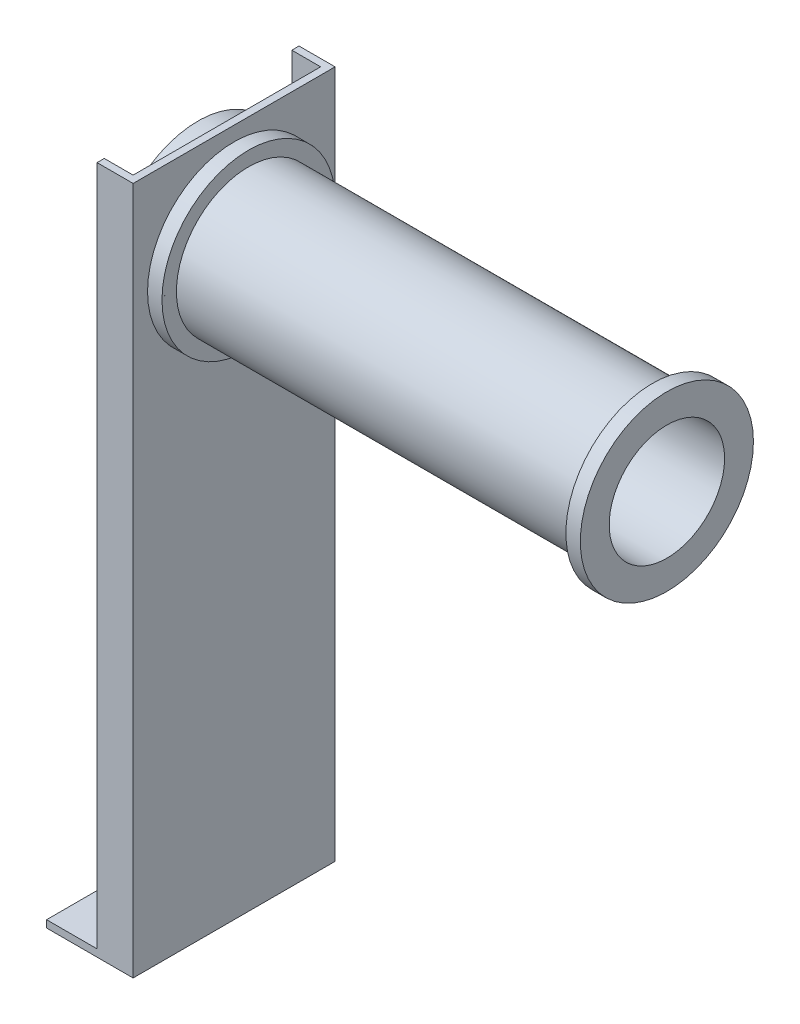
ISO-10303-21;
HEADER;
FILE_DESCRIPTION(('STEP AP214'),'2;1');
FILE_NAME('part.step','',(''),(''),'','','');
FILE_SCHEMA(('AUTOMOTIVE_DESIGN { 1 0 10303 214 1 1 1 1 }'));
ENDSEC;
DATA;
#1=APPLICATION_CONTEXT('core data for automotive mechanical design processes');
#2=APPLICATION_PROTOCOL_DEFINITION('international standard','automotive_design',2000,#1);
#3=PRODUCT_CONTEXT('',#1,'mechanical');
#4=PRODUCT('Part','Part','',(#3));
#5=PRODUCT_RELATED_PRODUCT_CATEGORY('part','',(#4));
#6=PRODUCT_DEFINITION_FORMATION('','',#4);
#7=PRODUCT_DEFINITION_CONTEXT('part definition',#1,'design');
#8=PRODUCT_DEFINITION('design','',#6,#7);
#9=PRODUCT_DEFINITION_SHAPE('','',#8);
#10=(LENGTH_UNIT() NAMED_UNIT(*) SI_UNIT(.MILLI.,.METRE.));
#11=(NAMED_UNIT(*) PLANE_ANGLE_UNIT() SI_UNIT($,.RADIAN.));
#12=(NAMED_UNIT(*) SI_UNIT($,.STERADIAN.) SOLID_ANGLE_UNIT());
#13=UNCERTAINTY_MEASURE_WITH_UNIT(LENGTH_MEASURE(1.E-05),#10,'distance_accuracy_value','');
#14=(GEOMETRIC_REPRESENTATION_CONTEXT(3) GLOBAL_UNCERTAINTY_ASSIGNED_CONTEXT((#13)) GLOBAL_UNIT_ASSIGNED_CONTEXT((#10,
#11,#12)) REPRESENTATION_CONTEXT('',''));
#15=CARTESIAN_POINT('',(0.,0.,0.));
#16=DIRECTION('',(0.,0.,1.));
#17=DIRECTION('',(1.,0.,0.));
#18=AXIS2_PLACEMENT_3D('',#15,#16,#17);
#19=CARTESIAN_POINT('',(0.,0.,0.));
#20=DIRECTION('',(-1.,0.,0.));
#21=DIRECTION('',(0.,0.,1.));
#22=AXIS2_PLACEMENT_3D('',#19,#20,#21);
#23=PLANE('',#22);
#24=CARTESIAN_POINT('',(0.,52.705,0.));
#25=DIRECTION('',(-1.,0.,0.));
#26=DIRECTION('',(0.,0.,1.));
#27=AXIS2_PLACEMENT_3D('',#24,#25,#26);
#28=CIRCLE('',#27,19.05);
#29=CARTESIAN_POINT('',(0.,52.705,19.05));
#30=VERTEX_POINT('',#29);
#31=EDGE_CURVE('E441',#30,#30,#28,.T.);
#32=ORIENTED_EDGE('',*,*,#31,.F.);
#33=EDGE_LOOP('',(#32));
#34=FACE_BOUND('',#33,.T.);
#35=DIRECTION('',(0.,0.,1.));
#36=VECTOR('',#35,1.);
#37=CARTESIAN_POINT('',(0.,74.93,22.225));
#38=LINE('',#37,#36);
#39=CARTESIAN_POINT('',(0.,74.93,-20.6375));
#40=VERTEX_POINT('',#39);
#41=CARTESIAN_POINT('',(0.,74.93,20.6375));
#42=VERTEX_POINT('',#41);
#43=EDGE_CURVE('E64',#40,#42,#38,.T.);
#44=ORIENTED_EDGE('',*,*,#43,.F.);
#45=DIRECTION('',(0.,1.,0.));
#46=VECTOR('',#45,1.);
#47=CARTESIAN_POINT('',(0.,74.93,-20.6375));
#48=LINE('',#47,#46);
#49=CARTESIAN_POINT('',(0.,-74.93,-20.6375));
#50=VERTEX_POINT('',#49);
#51=EDGE_CURVE('E173',#50,#40,#48,.T.);
#52=ORIENTED_EDGE('',*,*,#51,.F.);
#53=DIRECTION('',(0.,0.,-1.));
#54=VECTOR('',#53,1.);
#55=CARTESIAN_POINT('',(0.,-74.93,22.225));
#56=LINE('',#55,#54);
#57=CARTESIAN_POINT('',(0.,-74.93,20.6375));
#58=VERTEX_POINT('',#57);
#59=EDGE_CURVE('E226',#58,#50,#56,.T.);
#60=ORIENTED_EDGE('',*,*,#59,.F.);
#61=DIRECTION('',(0.,-1.,0.));
#62=VECTOR('',#61,1.);
#63=CARTESIAN_POINT('',(0.,74.93,20.6375));
#64=LINE('',#63,#62);
#65=EDGE_CURVE('E197',#42,#58,#64,.T.);
#66=ORIENTED_EDGE('',*,*,#65,.F.);
#67=EDGE_LOOP('',(#44,#52,#60,#66));
#68=FACE_BOUND('',#67,.T.);
#69=ADVANCED_FACE('F41',(#34,#68),#23,.T.);
#70=CARTESIAN_POINT('',(1.5875,-74.93,-22.225));
#71=DIRECTION('',(0.,0.,1.));
#72=DIRECTION('',(1.,0.,0.));
#73=AXIS2_PLACEMENT_3D('',#70,#71,#72);
#74=PLANE('',#73);
#75=DIRECTION('',(0.,1.,0.));
#76=VECTOR('',#75,1.);
#77=CARTESIAN_POINT('',(1.5875,-74.93,-22.225));
#78=LINE('',#77,#76);
#79=CARTESIAN_POINT('',(1.5875,-76.5175,-22.225));
#80=VERTEX_POINT('',#79);
#81=CARTESIAN_POINT('',(1.5875,74.93,-22.225));
#82=VERTEX_POINT('',#81);
#83=EDGE_CURVE('E223',#80,#82,#78,.T.);
#84=ORIENTED_EDGE('',*,*,#83,.F.);
#85=DIRECTION('',(1.,0.,0.));
#86=VECTOR('',#85,1.);
#87=CARTESIAN_POINT('',(1.5875,-76.5175,-22.225));
#88=LINE('',#87,#86);
#89=CARTESIAN_POINT('',(-17.4625,-76.5175,-22.225));
#90=VERTEX_POINT('',#89);
#91=EDGE_CURVE('E147',#90,#80,#88,.T.);
#92=ORIENTED_EDGE('',*,*,#91,.F.);
#93=DIRECTION('',(0.,1.,0.));
#94=VECTOR('',#93,1.);
#95=CARTESIAN_POINT('',(-17.4625,-76.5175,-22.225));
#96=LINE('',#95,#94);
#97=CARTESIAN_POINT('',(-17.4625,-74.93,-22.225));
#98=VERTEX_POINT('',#97);
#99=EDGE_CURVE('E162',#90,#98,#96,.T.);
#100=ORIENTED_EDGE('',*,*,#99,.T.);
#101=DIRECTION('',(1.,0.,0.));
#102=VECTOR('',#101,1.);
#103=CARTESIAN_POINT('',(1.5875,-74.93,-22.225));
#104=LINE('',#103,#102);
#105=CARTESIAN_POINT('',(-6.35,-74.93,-22.225));
#106=VERTEX_POINT('',#105);
#107=EDGE_CURVE('E149',#98,#106,#104,.T.);
#108=ORIENTED_EDGE('',*,*,#107,.T.);
#109=DIRECTION('',(0.,-1.,0.));
#110=VECTOR('',#109,1.);
#111=CARTESIAN_POINT('',(-6.35,74.93,-22.225));
#112=LINE('',#111,#110);
#113=CARTESIAN_POINT('',(-6.35,74.93,-22.225));
#114=VERTEX_POINT('',#113);
#115=EDGE_CURVE('E174',#114,#106,#112,.T.);
#116=ORIENTED_EDGE('',*,*,#115,.F.);
#117=DIRECTION('',(-1.,0.,0.));
#118=VECTOR('',#117,1.);
#119=CARTESIAN_POINT('',(1.5875,74.93,-22.225));
#120=LINE('',#119,#118);
#121=EDGE_CURVE('E235',#82,#114,#120,.T.);
#122=ORIENTED_EDGE('',*,*,#121,.F.);
#123=EDGE_LOOP('',(#84,#92,#100,#108,#116,#122));
#124=FACE_BOUND('',#123,.T.);
#125=ADVANCED_FACE('F43',(#124),#74,.F.);
#126=CARTESIAN_POINT('',(1.5875,74.93,22.225));
#127=DIRECTION('',(0.,-1.,0.));
#128=DIRECTION('',(0.,0.,-1.));
#129=AXIS2_PLACEMENT_3D('',#126,#127,#128);
#130=PLANE('',#129);
#131=ORIENTED_EDGE('',*,*,#121,.T.);
#132=DIRECTION('',(0.,0.,-1.));
#133=VECTOR('',#132,1.);
#134=CARTESIAN_POINT('',(-6.35,74.93,-22.225));
#135=LINE('',#134,#133);
#136=CARTESIAN_POINT('',(-6.35,74.93,-20.6375));
#137=VERTEX_POINT('',#136);
#138=EDGE_CURVE('E185',#137,#114,#135,.T.);
#139=ORIENTED_EDGE('',*,*,#138,.F.);
#140=DIRECTION('',(1.,0.,0.));
#141=VECTOR('',#140,1.);
#142=CARTESIAN_POINT('',(-6.35,74.93,-20.6375));
#143=LINE('',#142,#141);
#144=EDGE_CURVE('E59',#137,#40,#143,.T.);
#145=ORIENTED_EDGE('',*,*,#144,.T.);
#146=ORIENTED_EDGE('',*,*,#43,.T.);
#147=DIRECTION('',(1.,0.,0.));
#148=VECTOR('',#147,1.);
#149=CARTESIAN_POINT('',(-6.35,74.93,20.6375));
#150=LINE('',#149,#148);
#151=CARTESIAN_POINT('',(-6.35,74.93,20.6375));
#152=VERTEX_POINT('',#151);
#153=EDGE_CURVE('E219',#152,#42,#150,.T.);
#154=ORIENTED_EDGE('',*,*,#153,.F.);
#155=DIRECTION('',(0.,0.,-1.));
#156=VECTOR('',#155,1.);
#157=CARTESIAN_POINT('',(-6.35,74.93,22.225));
#158=LINE('',#157,#156);
#159=CARTESIAN_POINT('',(-6.35,74.93,22.225));
#160=VERTEX_POINT('',#159);
#161=EDGE_CURVE('E202',#160,#152,#158,.T.);
#162=ORIENTED_EDGE('',*,*,#161,.F.);
#163=DIRECTION('',(-1.,0.,0.));
#164=VECTOR('',#163,1.);
#165=CARTESIAN_POINT('',(1.5875,74.93,22.225));
#166=LINE('',#165,#164);
#167=CARTESIAN_POINT('',(1.5875,74.93,22.225));
#168=VERTEX_POINT('',#167);
#169=EDGE_CURVE('E132',#168,#160,#166,.T.);
#170=ORIENTED_EDGE('',*,*,#169,.F.);
#171=DIRECTION('',(0.,0.,1.));
#172=VECTOR('',#171,1.);
#173=CARTESIAN_POINT('',(1.5875,74.93,22.225));
#174=LINE('',#173,#172);
#175=EDGE_CURVE('E128',#82,#168,#174,.T.);
#176=ORIENTED_EDGE('',*,*,#175,.F.);
#177=EDGE_LOOP('',(#131,#139,#145,#146,#154,#162,#170,#176));
#178=FACE_BOUND('',#177,.T.);
#179=ADVANCED_FACE('F253',(#178),#130,.F.);
#180=CARTESIAN_POINT('',(1.5875,-74.93,22.225));
#181=DIRECTION('',(0.,0.,-1.));
#182=DIRECTION('',(-1.,0.,0.));
#183=AXIS2_PLACEMENT_3D('',#180,#181,#182);
#184=PLANE('',#183);
#185=ORIENTED_EDGE('',*,*,#169,.T.);
#186=DIRECTION('',(0.,1.,0.));
#187=VECTOR('',#186,1.);
#188=CARTESIAN_POINT('',(-6.35,74.93,22.225));
#189=LINE('',#188,#187);
#190=CARTESIAN_POINT('',(-6.35,-74.93,22.225));
#191=VERTEX_POINT('',#190);
#192=EDGE_CURVE('E198',#191,#160,#189,.T.);
#193=ORIENTED_EDGE('',*,*,#192,.F.);
#194=DIRECTION('',(-1.,0.,0.));
#195=VECTOR('',#194,1.);
#196=CARTESIAN_POINT('',(1.5875,-74.93,22.225));
#197=LINE('',#196,#195);
#198=CARTESIAN_POINT('',(-17.4625,-74.93,22.225));
#199=VERTEX_POINT('',#198);
#200=EDGE_CURVE('E163',#191,#199,#197,.T.);
#201=ORIENTED_EDGE('',*,*,#200,.T.);
#202=DIRECTION('',(0.,1.,0.));
#203=VECTOR('',#202,1.);
#204=CARTESIAN_POINT('',(-17.4625,-76.5175,22.225));
#205=LINE('',#204,#203);
#206=CARTESIAN_POINT('',(-17.4625,-76.5175,22.225));
#207=VERTEX_POINT('',#206);
#208=EDGE_CURVE('E138',#207,#199,#205,.T.);
#209=ORIENTED_EDGE('',*,*,#208,.F.);
#210=DIRECTION('',(-1.,0.,0.));
#211=VECTOR('',#210,1.);
#212=CARTESIAN_POINT('',(1.5875,-76.5175,22.225));
#213=LINE('',#212,#211);
#214=CARTESIAN_POINT('',(1.5875,-76.5175,22.225));
#215=VERTEX_POINT('',#214);
#216=EDGE_CURVE('E135',#215,#207,#213,.T.);
#217=ORIENTED_EDGE('',*,*,#216,.F.);
#218=DIRECTION('',(0.,-1.,0.));
#219=VECTOR('',#218,1.);
#220=CARTESIAN_POINT('',(1.5875,-74.93,22.225));
#221=LINE('',#220,#219);
#222=EDGE_CURVE('E122',#168,#215,#221,.T.);
#223=ORIENTED_EDGE('',*,*,#222,.F.);
#224=EDGE_LOOP('',(#185,#193,#201,#209,#217,#223));
#225=FACE_BOUND('',#224,.T.);
#226=ADVANCED_FACE('F136',(#225),#184,.F.);
#227=CARTESIAN_POINT('',(1.5875,0.,0.));
#228=DIRECTION('',(-1.,0.,0.));
#229=DIRECTION('',(0.,0.,1.));
#230=AXIS2_PLACEMENT_3D('',#227,#228,#229);
#231=PLANE('',#230);
#232=CARTESIAN_POINT('',(1.5875,52.705,0.));
#233=DIRECTION('',(-1.,0.,0.));
#234=DIRECTION('',(0.,0.,1.));
#235=AXIS2_PLACEMENT_3D('',#232,#233,#234);
#236=CIRCLE('',#235,19.05);
#237=CARTESIAN_POINT('',(1.5875,52.705,19.05));
#238=VERTEX_POINT('',#237);
#239=EDGE_CURVE('E51',#238,#238,#236,.F.);
#240=ORIENTED_EDGE('',*,*,#239,.F.);
#241=EDGE_LOOP('',(#240));
#242=FACE_BOUND('',#241,.T.);
#243=ORIENTED_EDGE('',*,*,#83,.T.);
#244=ORIENTED_EDGE('',*,*,#175,.T.);
#245=ORIENTED_EDGE('',*,*,#222,.T.);
#246=DIRECTION('',(0.,0.,1.));
#247=VECTOR('',#246,1.);
#248=CARTESIAN_POINT('',(1.5875,-76.5175,22.225));
#249=LINE('',#248,#247);
#250=EDGE_CURVE('E127',#80,#215,#249,.T.);
#251=ORIENTED_EDGE('',*,*,#250,.F.);
#252=EDGE_LOOP('',(#243,#244,#245,#251));
#253=FACE_BOUND('',#252,.T.);
#254=ADVANCED_FACE('F125',(#242,#253),#231,.F.);
#255=CARTESIAN_POINT('',(-6.35,74.93,20.6375));
#256=DIRECTION('',(0.,0.,1.));
#257=DIRECTION('',(0.,-1.,0.));
#258=AXIS2_PLACEMENT_3D('',#255,#256,#257);
#259=PLANE('',#258);
#260=ORIENTED_EDGE('',*,*,#65,.T.);
#261=DIRECTION('',(1.,0.,0.));
#262=VECTOR('',#261,1.);
#263=CARTESIAN_POINT('',(-6.35,-74.93,20.6375));
#264=LINE('',#263,#262);
#265=CARTESIAN_POINT('',(-6.35,-74.93,20.6375));
#266=VERTEX_POINT('',#265);
#267=EDGE_CURVE('E213',#266,#58,#264,.T.);
#268=ORIENTED_EDGE('',*,*,#267,.F.);
#269=DIRECTION('',(0.,-1.,0.));
#270=VECTOR('',#269,1.);
#271=CARTESIAN_POINT('',(-6.35,74.93,20.6375));
#272=LINE('',#271,#270);
#273=EDGE_CURVE('E205',#152,#266,#272,.T.);
#274=ORIENTED_EDGE('',*,*,#273,.F.);
#275=ORIENTED_EDGE('',*,*,#153,.T.);
#276=EDGE_LOOP('',(#260,#268,#274,#275));
#277=FACE_BOUND('',#276,.T.);
#278=ADVANCED_FACE('F244',(#277),#259,.F.);
#279=CARTESIAN_POINT('',(-6.35,0.,0.));
#280=DIRECTION('',(1.,0.,0.));
#281=DIRECTION('',(0.,0.,-1.));
#282=AXIS2_PLACEMENT_3D('',#279,#280,#281);
#283=PLANE('',#282);
#284=ORIENTED_EDGE('',*,*,#192,.T.);
#285=ORIENTED_EDGE('',*,*,#161,.T.);
#286=ORIENTED_EDGE('',*,*,#273,.T.);
#287=DIRECTION('',(0.,0.,1.));
#288=VECTOR('',#287,1.);
#289=CARTESIAN_POINT('',(-6.35,-74.93,22.225));
#290=LINE('',#289,#288);
#291=EDGE_CURVE('E209',#266,#191,#290,.T.);
#292=ORIENTED_EDGE('',*,*,#291,.T.);
#293=EDGE_LOOP('',(#284,#285,#286,#292));
#294=FACE_BOUND('',#293,.T.);
#295=ADVANCED_FACE('F250',(#294),#283,.F.);
#296=CARTESIAN_POINT('',(-6.35,74.93,-20.6375));
#297=DIRECTION('',(0.,0.,-1.));
#298=DIRECTION('',(0.,1.,0.));
#299=AXIS2_PLACEMENT_3D('',#296,#297,#298);
#300=PLANE('',#299);
#301=ORIENTED_EDGE('',*,*,#51,.T.);
#302=ORIENTED_EDGE('',*,*,#144,.F.);
#303=DIRECTION('',(0.,1.,0.));
#304=VECTOR('',#303,1.);
#305=CARTESIAN_POINT('',(-6.35,74.93,-20.6375));
#306=LINE('',#305,#304);
#307=CARTESIAN_POINT('',(-6.35,-74.93,-20.6375));
#308=VERTEX_POINT('',#307);
#309=EDGE_CURVE('E182',#308,#137,#306,.T.);
#310=ORIENTED_EDGE('',*,*,#309,.F.);
#311=DIRECTION('',(1.,0.,0.));
#312=VECTOR('',#311,1.);
#313=CARTESIAN_POINT('',(-6.35,-74.93,-20.6375));
#314=LINE('',#313,#312);
#315=EDGE_CURVE('E193',#308,#50,#314,.T.);
#316=ORIENTED_EDGE('',*,*,#315,.T.);
#317=EDGE_LOOP('',(#301,#302,#310,#316));
#318=FACE_BOUND('',#317,.T.);
#319=ADVANCED_FACE('F278',(#318),#300,.F.);
#320=CARTESIAN_POINT('',(-6.35,0.,0.));
#321=DIRECTION('',(-1.,0.,0.));
#322=DIRECTION('',(0.,0.,1.));
#323=AXIS2_PLACEMENT_3D('',#320,#321,#322);
#324=PLANE('',#323);
#325=ORIENTED_EDGE('',*,*,#115,.T.);
#326=DIRECTION('',(0.,0.,1.));
#327=VECTOR('',#326,1.);
#328=CARTESIAN_POINT('',(-6.35,-74.93,-22.225));
#329=LINE('',#328,#327);
#330=EDGE_CURVE('E178',#106,#308,#329,.T.);
#331=ORIENTED_EDGE('',*,*,#330,.T.);
#332=ORIENTED_EDGE('',*,*,#309,.T.);
#333=ORIENTED_EDGE('',*,*,#138,.T.);
#334=EDGE_LOOP('',(#325,#331,#332,#333));
#335=FACE_BOUND('',#334,.T.);
#336=ADVANCED_FACE('F270',(#335),#324,.T.);
#337=CARTESIAN_POINT('',(0.,-74.93,0.));
#338=DIRECTION('',(0.,1.,0.));
#339=DIRECTION('',(0.,0.,1.));
#340=AXIS2_PLACEMENT_3D('',#337,#338,#339);
#341=PLANE('',#340);
#342=ORIENTED_EDGE('',*,*,#291,.F.);
#343=ORIENTED_EDGE('',*,*,#267,.T.);
#344=ORIENTED_EDGE('',*,*,#59,.T.);
#345=ORIENTED_EDGE('',*,*,#315,.F.);
#346=ORIENTED_EDGE('',*,*,#330,.F.);
#347=ORIENTED_EDGE('',*,*,#107,.F.);
#348=DIRECTION('',(0.,0.,-1.));
#349=VECTOR('',#348,1.);
#350=CARTESIAN_POINT('',(-17.4625,-74.93,22.225));
#351=LINE('',#350,#349);
#352=EDGE_CURVE('E153',#199,#98,#351,.T.);
#353=ORIENTED_EDGE('',*,*,#352,.F.);
#354=ORIENTED_EDGE('',*,*,#200,.F.);
#355=EDGE_LOOP('',(#342,#343,#344,#345,#346,#347,#353,#354));
#356=FACE_BOUND('',#355,.T.);
#357=ADVANCED_FACE('F276',(#356),#341,.T.);
#358=CARTESIAN_POINT('',(-17.4625,-76.5175,22.225));
#359=DIRECTION('',(1.,0.,0.));
#360=DIRECTION('',(0.,0.,-1.));
#361=AXIS2_PLACEMENT_3D('',#358,#359,#360);
#362=PLANE('',#361);
#363=ORIENTED_EDGE('',*,*,#352,.T.);
#364=ORIENTED_EDGE('',*,*,#99,.F.);
#365=DIRECTION('',(0.,0.,-1.));
#366=VECTOR('',#365,1.);
#367=CARTESIAN_POINT('',(-17.4625,-76.5175,22.225));
#368=LINE('',#367,#366);
#369=EDGE_CURVE('E142',#207,#90,#368,.T.);
#370=ORIENTED_EDGE('',*,*,#369,.F.);
#371=ORIENTED_EDGE('',*,*,#208,.T.);
#372=EDGE_LOOP('',(#363,#364,#370,#371));
#373=FACE_BOUND('',#372,.T.);
#374=ADVANCED_FACE('F287',(#373),#362,.F.);
#375=CARTESIAN_POINT('',(0.,-76.5175,0.));
#376=DIRECTION('',(0.,1.,0.));
#377=DIRECTION('',(0.,0.,1.));
#378=AXIS2_PLACEMENT_3D('',#375,#376,#377);
#379=PLANE('',#378);
#380=ORIENTED_EDGE('',*,*,#250,.T.);
#381=ORIENTED_EDGE('',*,*,#216,.T.);
#382=ORIENTED_EDGE('',*,*,#369,.T.);
#383=ORIENTED_EDGE('',*,*,#91,.T.);
#384=EDGE_LOOP('',(#380,#381,#382,#383));
#385=FACE_BOUND('',#384,.T.);
#386=ADVANCED_FACE('F145',(#385),#379,.F.);
#387=CARTESIAN_POINT('',(4.7625,52.705,0.));
#388=DIRECTION('',(-1.,0.,0.));
#389=DIRECTION('',(0.,0.,1.));
#390=AXIS2_PLACEMENT_3D('',#387,#388,#389);
#391=CYLINDRICAL_SURFACE('',#390,19.05);
#392=CARTESIAN_POINT('',(4.7625,52.705,0.));
#393=DIRECTION('',(1.,0.,0.));
#394=DIRECTION('',(0.,0.,-1.));
#395=AXIS2_PLACEMENT_3D('',#392,#393,#394);
#396=CIRCLE('',#395,19.05);
#397=CARTESIAN_POINT('',(4.7625,52.705,-19.05));
#398=VERTEX_POINT('',#397);
#399=EDGE_CURVE('E156',#398,#398,#396,.T.);
#400=ORIENTED_EDGE('',*,*,#399,.F.);
#401=EDGE_LOOP('',(#400));
#402=FACE_BOUND('',#401,.T.);
#403=ORIENTED_EDGE('',*,*,#239,.T.);
#404=EDGE_LOOP('',(#403));
#405=FACE_BOUND('',#404,.T.);
#406=ADVANCED_FACE('F241',(#402,#405),#391,.T.);
#407=CARTESIAN_POINT('',(4.7625,0.,0.));
#408=DIRECTION('',(1.,0.,0.));
#409=DIRECTION('',(0.,0.,-1.));
#410=AXIS2_PLACEMENT_3D('',#407,#408,#409);
#411=PLANE('',#410);
#412=CARTESIAN_POINT('',(4.7625,52.705,0.));
#413=DIRECTION('',(1.,0.,0.));
#414=DIRECTION('',(0.,0.,-1.));
#415=AXIS2_PLACEMENT_3D('',#412,#413,#414);
#416=CIRCLE('',#415,15.875);
#417=CARTESIAN_POINT('',(4.7625,52.705,-15.875));
#418=VERTEX_POINT('',#417);
#419=EDGE_CURVE('E11',#418,#418,#416,.T.);
#420=ORIENTED_EDGE('',*,*,#419,.F.);
#421=EDGE_LOOP('',(#420));
#422=FACE_BOUND('',#421,.T.);
#423=ORIENTED_EDGE('',*,*,#399,.T.);
#424=EDGE_LOOP('',(#423));
#425=FACE_BOUND('',#424,.T.);
#426=ADVANCED_FACE('F343',(#422,#425),#411,.T.);
#427=CARTESIAN_POINT('',(93.6625,52.705,0.));
#428=DIRECTION('',(-1.,0.,0.));
#429=DIRECTION('',(0.,0.,1.));
#430=AXIS2_PLACEMENT_3D('',#427,#428,#429);
#431=CYLINDRICAL_SURFACE('',#430,15.875);
#432=CARTESIAN_POINT('',(93.6625,52.705,0.));
#433=DIRECTION('',(1.,0.,0.));
#434=DIRECTION('',(0.,0.,-1.));
#435=AXIS2_PLACEMENT_3D('',#432,#433,#434);
#436=CIRCLE('',#435,15.875);
#437=CARTESIAN_POINT('',(93.6625,52.705,-15.875));
#438=VERTEX_POINT('',#437);
#439=EDGE_CURVE('E455',#438,#438,#436,.T.);
#440=ORIENTED_EDGE('',*,*,#439,.F.);
#441=EDGE_LOOP('',(#440));
#442=FACE_BOUND('',#441,.T.);
#443=ORIENTED_EDGE('',*,*,#419,.T.);
#444=EDGE_LOOP('',(#443));
#445=FACE_BOUND('',#444,.T.);
#446=ADVANCED_FACE('F353',(#442,#445),#431,.T.);
#447=CARTESIAN_POINT('',(96.8375,52.705,0.));
#448=DIRECTION('',(-1.,0.,0.));
#449=DIRECTION('',(0.,0.,1.));
#450=AXIS2_PLACEMENT_3D('',#447,#448,#449);
#451=CYLINDRICAL_SURFACE('',#450,19.05);
#452=CARTESIAN_POINT('',(96.8375,52.705,0.));
#453=DIRECTION('',(1.,0.,0.));
#454=DIRECTION('',(0.,0.,-1.));
#455=AXIS2_PLACEMENT_3D('',#452,#453,#454);
#456=CIRCLE('',#455,19.05);
#457=CARTESIAN_POINT('',(96.8375,52.705,-19.05));
#458=VERTEX_POINT('',#457);
#459=EDGE_CURVE('E451',#458,#458,#456,.T.);
#460=ORIENTED_EDGE('',*,*,#459,.F.);
#461=EDGE_LOOP('',(#460));
#462=FACE_BOUND('',#461,.T.);
#463=CARTESIAN_POINT('',(93.6625,52.705,0.));
#464=DIRECTION('',(1.,0.,0.));
#465=DIRECTION('',(0.,0.,-1.));
#466=AXIS2_PLACEMENT_3D('',#463,#464,#465);
#467=CIRCLE('',#466,19.05);
#468=CARTESIAN_POINT('',(93.6625,52.705,-19.05));
#469=VERTEX_POINT('',#468);
#470=EDGE_CURVE('E447',#469,#469,#467,.T.);
#471=ORIENTED_EDGE('',*,*,#470,.T.);
#472=EDGE_LOOP('',(#471));
#473=FACE_BOUND('',#472,.T.);
#474=ADVANCED_FACE('F363',(#462,#473),#451,.T.);
#475=CARTESIAN_POINT('',(96.8375,52.705,0.));
#476=DIRECTION('',(1.,0.,0.));
#477=DIRECTION('',(0.,0.,-1.));
#478=AXIS2_PLACEMENT_3D('',#475,#476,#477);
#479=PLANE('',#478);
#480=CARTESIAN_POINT('',(96.8375,52.705,0.));
#481=DIRECTION('',(1.,0.,0.));
#482=DIRECTION('',(0.,0.,-1.));
#483=AXIS2_PLACEMENT_3D('',#480,#481,#482);
#484=CIRCLE('',#483,12.7);
#485=CARTESIAN_POINT('',(96.8375,52.705,-12.7));
#486=VERTEX_POINT('',#485);
#487=EDGE_CURVE('E437',#486,#486,#484,.T.);
#488=ORIENTED_EDGE('',*,*,#487,.F.);
#489=EDGE_LOOP('',(#488));
#490=FACE_BOUND('',#489,.T.);
#491=ORIENTED_EDGE('',*,*,#459,.T.);
#492=EDGE_LOOP('',(#491));
#493=FACE_BOUND('',#492,.T.);
#494=ADVANCED_FACE('F373',(#490,#493),#479,.T.);
#495=CARTESIAN_POINT('',(93.6625,52.705,0.));
#496=DIRECTION('',(1.,0.,0.));
#497=DIRECTION('',(0.,0.,-1.));
#498=AXIS2_PLACEMENT_3D('',#495,#496,#497);
#499=PLANE('',#498);
#500=ORIENTED_EDGE('',*,*,#439,.T.);
#501=EDGE_LOOP('',(#500));
#502=FACE_BOUND('',#501,.T.);
#503=ORIENTED_EDGE('',*,*,#470,.F.);
#504=EDGE_LOOP('',(#503));
#505=FACE_BOUND('',#504,.T.);
#506=ADVANCED_FACE('F381',(#502,#505),#499,.F.);
#507=CARTESIAN_POINT('',(-6.35,52.705,0.));
#508=DIRECTION('',(1.,0.,0.));
#509=DIRECTION('',(0.,0.,-1.));
#510=AXIS2_PLACEMENT_3D('',#507,#508,#509);
#511=CYLINDRICAL_SURFACE('',#510,19.05);
#512=CARTESIAN_POINT('',(-6.35,52.705,0.));
#513=DIRECTION('',(-1.,0.,0.));
#514=DIRECTION('',(0.,0.,1.));
#515=AXIS2_PLACEMENT_3D('',#512,#513,#514);
#516=CIRCLE('',#515,19.05);
#517=CARTESIAN_POINT('',(-6.35,52.705,19.05));
#518=VERTEX_POINT('',#517);
#519=EDGE_CURVE('E443',#518,#518,#516,.T.);
#520=ORIENTED_EDGE('',*,*,#519,.F.);
#521=EDGE_LOOP('',(#520));
#522=FACE_BOUND('',#521,.T.);
#523=ORIENTED_EDGE('',*,*,#31,.T.);
#524=EDGE_LOOP('',(#523));
#525=FACE_BOUND('',#524,.T.);
#526=ADVANCED_FACE('F385',(#522,#525),#511,.T.);
#527=CARTESIAN_POINT('',(-6.35,0.,0.));
#528=DIRECTION('',(-1.,0.,0.));
#529=DIRECTION('',(0.,0.,1.));
#530=AXIS2_PLACEMENT_3D('',#527,#528,#529);
#531=PLANE('',#530);
#532=CARTESIAN_POINT('',(-6.35,52.705,0.));
#533=DIRECTION('',(-1.,0.,0.));
#534=DIRECTION('',(0.,0.,1.));
#535=AXIS2_PLACEMENT_3D('',#532,#533,#534);
#536=CIRCLE('',#535,12.7);
#537=CARTESIAN_POINT('',(-6.35,52.705,12.7));
#538=VERTEX_POINT('',#537);
#539=EDGE_CURVE('E45',#538,#538,#536,.T.);
#540=ORIENTED_EDGE('',*,*,#539,.F.);
#541=EDGE_LOOP('',(#540));
#542=FACE_BOUND('',#541,.T.);
#543=ORIENTED_EDGE('',*,*,#519,.T.);
#544=EDGE_LOOP('',(#543));
#545=FACE_BOUND('',#544,.T.);
#546=ADVANCED_FACE('F401',(#542,#545),#531,.T.);
#547=CARTESIAN_POINT('',(-16.8275,52.705,0.));
#548=DIRECTION('',(1.,0.,0.));
#549=DIRECTION('',(0.,0.,-1.));
#550=AXIS2_PLACEMENT_3D('',#547,#548,#549);
#551=CYLINDRICAL_SURFACE('',#550,12.7);
#552=ORIENTED_EDGE('',*,*,#539,.T.);
#553=EDGE_LOOP('',(#552));
#554=FACE_BOUND('',#553,.T.);
#555=ORIENTED_EDGE('',*,*,#487,.T.);
#556=EDGE_LOOP('',(#555));
#557=FACE_BOUND('',#556,.T.);
#558=ADVANCED_FACE('F418',(#554,#557),#551,.F.);
#559=CLOSED_SHELL('',(#69,#125,#179,#226,#254,#278,#295,#319,#336,#357,#374,#386,#406,#426,#446,
#474,#494,#506,#526,#546,#558));
#560=MANIFOLD_SOLID_BREP('B2',#559);
#561=ADVANCED_BREP_SHAPE_REPRESENTATION('',(#18,#560),#14);
#562=SHAPE_DEFINITION_REPRESENTATION(#9,#561);
ENDSEC;
END-ISO-10303-21;
